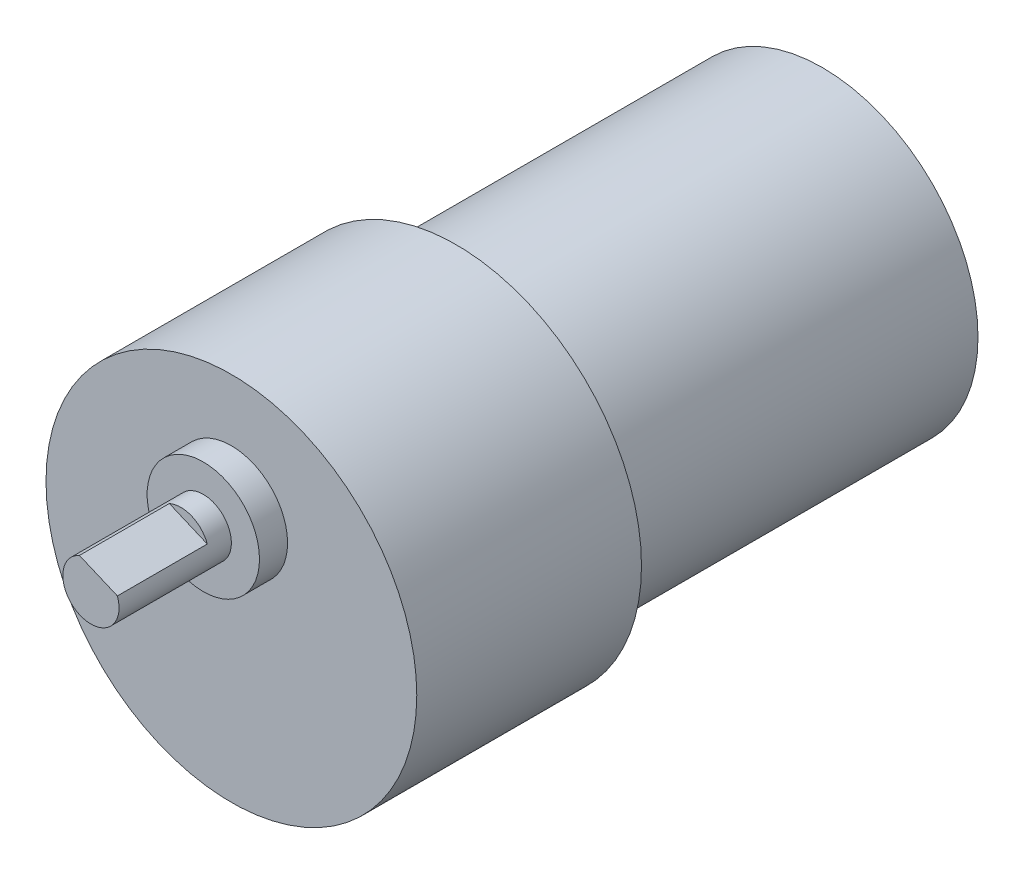
ISO-10303-21;
HEADER;
FILE_DESCRIPTION(('STEP AP214'),'2;1');
FILE_NAME('part.step','',(''),(''),'','','');
FILE_SCHEMA(('AUTOMOTIVE_DESIGN { 1 0 10303 214 1 1 1 1 }'));
ENDSEC;
DATA;
#1=APPLICATION_CONTEXT('core data for automotive mechanical design processes');
#2=APPLICATION_PROTOCOL_DEFINITION('international standard','automotive_design',2000,#1);
#3=PRODUCT_CONTEXT('',#1,'mechanical');
#4=PRODUCT('Part','Part','',(#3));
#5=PRODUCT_RELATED_PRODUCT_CATEGORY('part','',(#4));
#6=PRODUCT_DEFINITION_FORMATION('','',#4);
#7=PRODUCT_DEFINITION_CONTEXT('part definition',#1,'design');
#8=PRODUCT_DEFINITION('design','',#6,#7);
#9=PRODUCT_DEFINITION_SHAPE('','',#8);
#10=(LENGTH_UNIT() NAMED_UNIT(*) SI_UNIT(.MILLI.,.METRE.));
#11=(NAMED_UNIT(*) PLANE_ANGLE_UNIT() SI_UNIT($,.RADIAN.));
#12=(NAMED_UNIT(*) SI_UNIT($,.STERADIAN.) SOLID_ANGLE_UNIT());
#13=UNCERTAINTY_MEASURE_WITH_UNIT(LENGTH_MEASURE(1.E-05),#10,'distance_accuracy_value','');
#14=(GEOMETRIC_REPRESENTATION_CONTEXT(3) GLOBAL_UNCERTAINTY_ASSIGNED_CONTEXT((#13)) GLOBAL_UNIT_ASSIGNED_CONTEXT((#10,
#11,#12)) REPRESENTATION_CONTEXT('',''));
#15=CARTESIAN_POINT('',(0.,0.,0.));
#16=DIRECTION('',(0.,0.,1.));
#17=DIRECTION('',(1.,0.,0.));
#18=AXIS2_PLACEMENT_3D('',#15,#16,#17);
#19=CARTESIAN_POINT('',(0.,0.,20.));
#20=DIRECTION('',(0.,0.,-1.));
#21=DIRECTION('',(-1.,0.,0.));
#22=AXIS2_PLACEMENT_3D('',#19,#20,#21);
#23=CYLINDRICAL_SURFACE('',#22,16.5);
#24=CARTESIAN_POINT('',(0.,0.,20.));
#25=DIRECTION('',(0.,0.,1.));
#26=DIRECTION('',(1.,0.,0.));
#27=AXIS2_PLACEMENT_3D('',#24,#25,#26);
#28=CIRCLE('',#27,16.5);
#29=CARTESIAN_POINT('',(16.5,0.,20.));
#30=VERTEX_POINT('',#29);
#31=EDGE_CURVE('E99',#30,#30,#28,.T.);
#32=ORIENTED_EDGE('',*,*,#31,.F.);
#33=EDGE_LOOP('',(#32));
#34=FACE_BOUND('',#33,.T.);
#35=CARTESIAN_POINT('',(0.,0.,0.));
#36=DIRECTION('',(0.,0.,1.));
#37=DIRECTION('',(1.,0.,0.));
#38=AXIS2_PLACEMENT_3D('',#35,#36,#37);
#39=CIRCLE('',#38,16.5);
#40=CARTESIAN_POINT('',(16.5,0.,0.));
#41=VERTEX_POINT('',#40);
#42=EDGE_CURVE('E36',#41,#41,#39,.T.);
#43=ORIENTED_EDGE('',*,*,#42,.T.);
#44=EDGE_LOOP('',(#43));
#45=FACE_BOUND('',#44,.T.);
#46=ADVANCED_FACE('F33',(#34,#45),#23,.T.);
#47=CARTESIAN_POINT('',(0.,0.,20.));
#48=DIRECTION('',(0.,0.,1.));
#49=DIRECTION('',(1.,0.,0.));
#50=AXIS2_PLACEMENT_3D('',#47,#48,#49);
#51=PLANE('',#50);
#52=CARTESIAN_POINT('',(0.,6.,20.));
#53=DIRECTION('',(0.,0.,1.));
#54=DIRECTION('',(1.,0.,0.));
#55=AXIS2_PLACEMENT_3D('',#52,#53,#54);
#56=CIRCLE('',#55,5.);
#57=CARTESIAN_POINT('',(5.,6.,20.));
#58=VERTEX_POINT('',#57);
#59=EDGE_CURVE('E74',#58,#58,#56,.T.);
#60=ORIENTED_EDGE('',*,*,#59,.F.);
#61=EDGE_LOOP('',(#60));
#62=FACE_BOUND('',#61,.T.);
#63=ORIENTED_EDGE('',*,*,#31,.T.);
#64=EDGE_LOOP('',(#63));
#65=FACE_BOUND('',#64,.T.);
#66=ADVANCED_FACE('F110',(#62,#65),#51,.T.);
#67=CARTESIAN_POINT('',(0.,0.,0.));
#68=DIRECTION('',(0.,0.,1.));
#69=DIRECTION('',(1.,0.,0.));
#70=AXIS2_PLACEMENT_3D('',#67,#68,#69);
#71=PLANE('',#70);
#72=CARTESIAN_POINT('',(0.,0.,0.));
#73=DIRECTION('',(0.,0.,-1.));
#74=DIRECTION('',(-1.,0.,0.));
#75=AXIS2_PLACEMENT_3D('',#72,#73,#74);
#76=CIRCLE('',#75,13.85);
#77=CARTESIAN_POINT('',(-13.85,0.,0.));
#78=VERTEX_POINT('',#77);
#79=EDGE_CURVE('E95',#78,#78,#76,.T.);
#80=ORIENTED_EDGE('',*,*,#79,.F.);
#81=EDGE_LOOP('',(#80));
#82=FACE_BOUND('',#81,.T.);
#83=ORIENTED_EDGE('',*,*,#42,.F.);
#84=EDGE_LOOP('',(#83));
#85=FACE_BOUND('',#84,.T.);
#86=ADVANCED_FACE('F107',(#82,#85),#71,.F.);
#87=CARTESIAN_POINT('',(0.,0.,-32.6));
#88=DIRECTION('',(0.,0.,1.));
#89=DIRECTION('',(1.,0.,0.));
#90=AXIS2_PLACEMENT_3D('',#87,#88,#89);
#91=CYLINDRICAL_SURFACE('',#90,13.85);
#92=CARTESIAN_POINT('',(0.,0.,-32.6));
#93=DIRECTION('',(0.,0.,-1.));
#94=DIRECTION('',(-1.,0.,0.));
#95=AXIS2_PLACEMENT_3D('',#92,#93,#94);
#96=CIRCLE('',#95,13.85);
#97=CARTESIAN_POINT('',(-13.85,0.,-32.6));
#98=VERTEX_POINT('',#97);
#99=EDGE_CURVE('E92',#98,#98,#96,.T.);
#100=ORIENTED_EDGE('',*,*,#99,.F.);
#101=EDGE_LOOP('',(#100));
#102=FACE_BOUND('',#101,.T.);
#103=ORIENTED_EDGE('',*,*,#79,.T.);
#104=EDGE_LOOP('',(#103));
#105=FACE_BOUND('',#104,.T.);
#106=ADVANCED_FACE('F109',(#102,#105),#91,.T.);
#107=CARTESIAN_POINT('',(0.,0.,-32.6));
#108=DIRECTION('',(0.,0.,-1.));
#109=DIRECTION('',(-1.,0.,0.));
#110=AXIS2_PLACEMENT_3D('',#107,#108,#109);
#111=PLANE('',#110);
#112=CARTESIAN_POINT('',(0.,0.,-32.6));
#113=DIRECTION('',(0.,0.,-1.));
#114=DIRECTION('',(-1.,0.,0.));
#115=AXIS2_PLACEMENT_3D('',#112,#113,#114);
#116=CIRCLE('',#115,5.);
#117=CARTESIAN_POINT('',(-5.,0.,-32.6));
#118=VERTEX_POINT('',#117);
#119=EDGE_CURVE('E89',#118,#118,#116,.T.);
#120=ORIENTED_EDGE('',*,*,#119,.F.);
#121=EDGE_LOOP('',(#120));
#122=FACE_BOUND('',#121,.T.);
#123=ORIENTED_EDGE('',*,*,#99,.T.);
#124=EDGE_LOOP('',(#123));
#125=FACE_BOUND('',#124,.T.);
#126=ADVANCED_FACE('F116',(#122,#125),#111,.T.);
#127=CARTESIAN_POINT('',(0.,0.,-34.8));
#128=DIRECTION('',(0.,0.,1.));
#129=DIRECTION('',(1.,0.,0.));
#130=AXIS2_PLACEMENT_3D('',#127,#128,#129);
#131=CYLINDRICAL_SURFACE('',#130,5.);
#132=CARTESIAN_POINT('',(0.,0.,-34.8));
#133=DIRECTION('',(0.,0.,-1.));
#134=DIRECTION('',(-1.,0.,0.));
#135=AXIS2_PLACEMENT_3D('',#132,#133,#134);
#136=CIRCLE('',#135,5.);
#137=CARTESIAN_POINT('',(-5.,0.,-34.8));
#138=VERTEX_POINT('',#137);
#139=EDGE_CURVE('E86',#138,#138,#136,.T.);
#140=ORIENTED_EDGE('',*,*,#139,.F.);
#141=EDGE_LOOP('',(#140));
#142=FACE_BOUND('',#141,.T.);
#143=ORIENTED_EDGE('',*,*,#119,.T.);
#144=EDGE_LOOP('',(#143));
#145=FACE_BOUND('',#144,.T.);
#146=ADVANCED_FACE('F205',(#142,#145),#131,.T.);
#147=CARTESIAN_POINT('',(0.,0.,-34.8));
#148=DIRECTION('',(0.,0.,-1.));
#149=DIRECTION('',(-1.,0.,0.));
#150=AXIS2_PLACEMENT_3D('',#147,#148,#149);
#151=PLANE('',#150);
#152=CARTESIAN_POINT('',(0.,0.,-34.8));
#153=DIRECTION('',(0.,0.,-1.));
#154=DIRECTION('',(-1.,0.,0.));
#155=AXIS2_PLACEMENT_3D('',#152,#153,#154);
#156=CIRCLE('',#155,1.15);
#157=CARTESIAN_POINT('',(-1.15,0.,-34.8));
#158=VERTEX_POINT('',#157);
#159=EDGE_CURVE('E41',#158,#158,#156,.T.);
#160=ORIENTED_EDGE('',*,*,#159,.F.);
#161=EDGE_LOOP('',(#160));
#162=FACE_BOUND('',#161,.T.);
#163=ORIENTED_EDGE('',*,*,#139,.T.);
#164=EDGE_LOOP('',(#163));
#165=FACE_BOUND('',#164,.T.);
#166=ADVANCED_FACE('F201',(#162,#165),#151,.T.);
#167=CARTESIAN_POINT('',(0.,0.,-38.1));
#168=DIRECTION('',(0.,0.,1.));
#169=DIRECTION('',(1.,0.,0.));
#170=AXIS2_PLACEMENT_3D('',#167,#168,#169);
#171=CYLINDRICAL_SURFACE('',#170,1.15);
#172=CARTESIAN_POINT('',(0.,0.,-38.1));
#173=DIRECTION('',(0.,0.,-1.));
#174=DIRECTION('',(-1.,0.,0.));
#175=AXIS2_PLACEMENT_3D('',#172,#173,#174);
#176=CIRCLE('',#175,1.15);
#177=CARTESIAN_POINT('',(-1.15,0.,-38.1));
#178=VERTEX_POINT('',#177);
#179=EDGE_CURVE('E82',#178,#178,#176,.T.);
#180=ORIENTED_EDGE('',*,*,#179,.F.);
#181=EDGE_LOOP('',(#180));
#182=FACE_BOUND('',#181,.T.);
#183=ORIENTED_EDGE('',*,*,#159,.T.);
#184=EDGE_LOOP('',(#183));
#185=FACE_BOUND('',#184,.T.);
#186=ADVANCED_FACE('F197',(#182,#185),#171,.T.);
#187=CARTESIAN_POINT('',(0.,0.,-38.1));
#188=DIRECTION('',(0.,0.,-1.));
#189=DIRECTION('',(-1.,0.,0.));
#190=AXIS2_PLACEMENT_3D('',#187,#188,#189);
#191=PLANE('',#190);
#192=ORIENTED_EDGE('',*,*,#179,.T.);
#193=EDGE_LOOP('',(#192));
#194=FACE_BOUND('',#193,.T.);
#195=ADVANCED_FACE('F137',(#194),#191,.T.);
#196=CARTESIAN_POINT('',(0.,6.,22.5));
#197=DIRECTION('',(0.,0.,-1.));
#198=DIRECTION('',(-1.,0.,0.));
#199=AXIS2_PLACEMENT_3D('',#196,#197,#198);
#200=CYLINDRICAL_SURFACE('',#199,5.);
#201=CARTESIAN_POINT('',(0.,6.,22.5));
#202=DIRECTION('',(0.,0.,1.));
#203=DIRECTION('',(1.,0.,0.));
#204=AXIS2_PLACEMENT_3D('',#201,#202,#203);
#205=CIRCLE('',#204,5.);
#206=CARTESIAN_POINT('',(5.,6.,22.5));
#207=VERTEX_POINT('',#206);
#208=EDGE_CURVE('E77',#207,#207,#205,.T.);
#209=ORIENTED_EDGE('',*,*,#208,.F.);
#210=EDGE_LOOP('',(#209));
#211=FACE_BOUND('',#210,.T.);
#212=ORIENTED_EDGE('',*,*,#59,.T.);
#213=EDGE_LOOP('',(#212));
#214=FACE_BOUND('',#213,.T.);
#215=ADVANCED_FACE('F142',(#211,#214),#200,.T.);
#216=CARTESIAN_POINT('',(0.,6.,22.5));
#217=DIRECTION('',(0.,0.,1.));
#218=DIRECTION('',(1.,0.,0.));
#219=AXIS2_PLACEMENT_3D('',#216,#217,#218);
#220=PLANE('',#219);
#221=CARTESIAN_POINT('',(0.,6.,22.5));
#222=DIRECTION('',(0.,0.,1.));
#223=DIRECTION('',(1.,0.,0.));
#224=AXIS2_PLACEMENT_3D('',#221,#222,#223);
#225=CIRCLE('',#224,2.5);
#226=CARTESIAN_POINT('',(2.5,6.,22.5));
#227=VERTEX_POINT('',#226);
#228=EDGE_CURVE('E11',#227,#227,#225,.T.);
#229=ORIENTED_EDGE('',*,*,#228,.F.);
#230=EDGE_LOOP('',(#229));
#231=FACE_BOUND('',#230,.T.);
#232=ORIENTED_EDGE('',*,*,#208,.T.);
#233=EDGE_LOOP('',(#232));
#234=FACE_BOUND('',#233,.T.);
#235=ADVANCED_FACE('F147',(#231,#234),#220,.T.);
#236=CARTESIAN_POINT('',(0.,6.,32.5));
#237=DIRECTION('',(0.,0.,-1.));
#238=DIRECTION('',(-1.,0.,0.));
#239=AXIS2_PLACEMENT_3D('',#236,#237,#238);
#240=CYLINDRICAL_SURFACE('',#239,2.5);
#241=CARTESIAN_POINT('',(0.,6.,32.5));
#242=DIRECTION('',(0.,0.,1.));
#243=DIRECTION('',(1.,0.,0.));
#244=AXIS2_PLACEMENT_3D('',#241,#242,#243);
#245=CIRCLE('',#244,2.5);
#246=CARTESIAN_POINT('',(-1.02417146106144,8.28058606905052,32.5));
#247=VERTEX_POINT('',#246);
#248=CARTESIAN_POINT('',(2.35219285719505,6.84686997972569,32.5));
#249=VERTEX_POINT('',#248);
#250=EDGE_CURVE('E71',#247,#249,#245,.T.);
#251=ORIENTED_EDGE('',*,*,#250,.F.);
#252=DIRECTION('',(0.,0.,1.));
#253=VECTOR('',#252,1.);
#254=CARTESIAN_POINT('',(-1.02417146106144,8.28058606905052,24.5));
#255=LINE('',#254,#253);
#256=CARTESIAN_POINT('',(-1.02417146106144,8.28058606905052,24.5));
#257=VERTEX_POINT('',#256);
#258=EDGE_CURVE('E49',#257,#247,#255,.T.);
#259=ORIENTED_EDGE('',*,*,#258,.F.);
#260=CARTESIAN_POINT('',(0.,6.,24.5));
#261=DIRECTION('',(0.,0.,1.));
#262=DIRECTION('',(-1.,0.,0.));
#263=AXIS2_PLACEMENT_3D('',#260,#261,#262);
#264=CIRCLE('',#263,2.5);
#265=CARTESIAN_POINT('',(2.35219285719505,6.84686997972569,24.5));
#266=VERTEX_POINT('',#265);
#267=EDGE_CURVE('E65',#266,#257,#264,.T.);
#268=ORIENTED_EDGE('',*,*,#267,.F.);
#269=DIRECTION('',(0.,0.,1.));
#270=VECTOR('',#269,1.);
#271=CARTESIAN_POINT('',(2.35219285719505,6.84686997972569,24.5));
#272=LINE('',#271,#270);
#273=EDGE_CURVE('E55',#266,#249,#272,.T.);
#274=ORIENTED_EDGE('',*,*,#273,.T.);
#275=EDGE_LOOP('',(#251,#259,#268,#274));
#276=FACE_BOUND('',#275,.T.);
#277=ORIENTED_EDGE('',*,*,#228,.T.);
#278=EDGE_LOOP('',(#277));
#279=FACE_BOUND('',#278,.T.);
#280=ADVANCED_FACE('F69',(#276,#279),#240,.T.);
#281=CARTESIAN_POINT('',(0.,6.,32.5));
#282=DIRECTION('',(0.,0.,1.));
#283=DIRECTION('',(1.,0.,0.));
#284=AXIS2_PLACEMENT_3D('',#281,#282,#283);
#285=PLANE('',#284);
#286=DIRECTION('',(0.920452439762587,-0.390854584385423,0.));
#287=VECTOR('',#286,1.);
#288=CARTESIAN_POINT('',(-1.02417146106144,8.28058606905052,32.5));
#289=LINE('',#288,#287);
#290=EDGE_CURVE('E60',#247,#249,#289,.T.);
#291=ORIENTED_EDGE('',*,*,#290,.F.);
#292=ORIENTED_EDGE('',*,*,#250,.T.);
#293=EDGE_LOOP('',(#291,#292));
#294=FACE_BOUND('',#293,.T.);
#295=ADVANCED_FACE('F73',(#294),#285,.T.);
#296=CARTESIAN_POINT('',(-1.02417146106144,8.28058606905052,24.5));
#297=DIRECTION('',(-0.390854584385423,-0.920452439762587,0.));
#298=DIRECTION('',(0.920452439762587,-0.390854584385423,0.));
#299=AXIS2_PLACEMENT_3D('',#296,#297,#298);
#300=PLANE('',#299);
#301=ORIENTED_EDGE('',*,*,#290,.T.);
#302=ORIENTED_EDGE('',*,*,#273,.F.);
#303=DIRECTION('',(0.920452439762587,-0.390854584385423,0.));
#304=VECTOR('',#303,1.);
#305=CARTESIAN_POINT('',(-1.02417146106144,8.28058606905052,24.5));
#306=LINE('',#305,#304);
#307=EDGE_CURVE('E257',#257,#266,#306,.T.);
#308=ORIENTED_EDGE('',*,*,#307,.F.);
#309=ORIENTED_EDGE('',*,*,#258,.T.);
#310=EDGE_LOOP('',(#301,#302,#308,#309));
#311=FACE_BOUND('',#310,.T.);
#312=ADVANCED_FACE('F61',(#311),#300,.F.);
#313=CARTESIAN_POINT('',(0.,6.,24.5));
#314=DIRECTION('',(0.,0.,-1.));
#315=DIRECTION('',(-1.,0.,0.));
#316=AXIS2_PLACEMENT_3D('',#313,#314,#315);
#317=PLANE('',#316);
#318=ORIENTED_EDGE('',*,*,#267,.T.);
#319=ORIENTED_EDGE('',*,*,#307,.T.);
#320=EDGE_LOOP('',(#318,#319));
#321=FACE_BOUND('',#320,.T.);
#322=ADVANCED_FACE('F182',(#321),#317,.F.);
#323=CLOSED_SHELL('',(#46,#66,#86,#106,#126,#146,#166,#186,#195,#215,#235,#280,#295,#312,#322));
#324=MANIFOLD_SOLID_BREP('B2',#323);
#325=ADVANCED_BREP_SHAPE_REPRESENTATION('',(#18,#324),#14);
#326=SHAPE_DEFINITION_REPRESENTATION(#9,#325);
ENDSEC;
END-ISO-10303-21;
